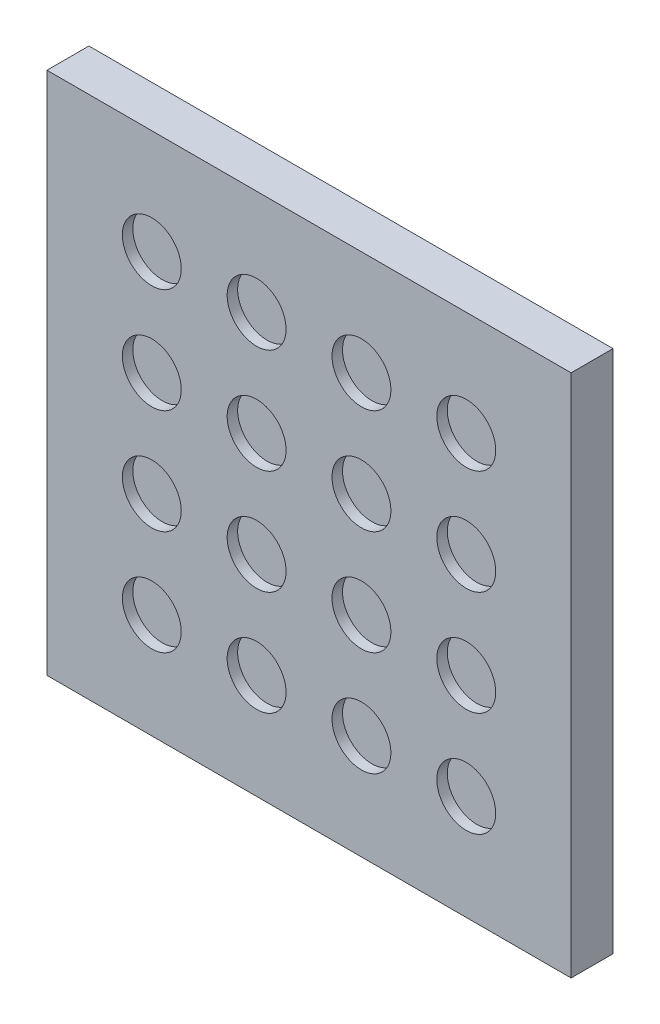
ISO-10303-21;
HEADER;
FILE_DESCRIPTION(('STEP AP214'),'2;1');
FILE_NAME('part.step','',(''),(''),'','','');
FILE_SCHEMA(('AUTOMOTIVE_DESIGN { 1 0 10303 214 1 1 1 1 }'));
ENDSEC;
DATA;
#1=APPLICATION_CONTEXT('core data for automotive mechanical design processes');
#2=APPLICATION_PROTOCOL_DEFINITION('international standard','automotive_design',2000,#1);
#3=PRODUCT_CONTEXT('',#1,'mechanical');
#4=PRODUCT('Part','Part','',(#3));
#5=PRODUCT_RELATED_PRODUCT_CATEGORY('part','',(#4));
#6=PRODUCT_DEFINITION_FORMATION('','',#4);
#7=PRODUCT_DEFINITION_CONTEXT('part definition',#1,'design');
#8=PRODUCT_DEFINITION('design','',#6,#7);
#9=PRODUCT_DEFINITION_SHAPE('','',#8);
#10=(LENGTH_UNIT() NAMED_UNIT(*) SI_UNIT(.MILLI.,.METRE.));
#11=(NAMED_UNIT(*) PLANE_ANGLE_UNIT() SI_UNIT($,.RADIAN.));
#12=(NAMED_UNIT(*) SI_UNIT($,.STERADIAN.) SOLID_ANGLE_UNIT());
#13=UNCERTAINTY_MEASURE_WITH_UNIT(LENGTH_MEASURE(1.E-05),#10,'distance_accuracy_value','');
#14=(GEOMETRIC_REPRESENTATION_CONTEXT(3) GLOBAL_UNCERTAINTY_ASSIGNED_CONTEXT((#13)) GLOBAL_UNIT_ASSIGNED_CONTEXT((#10,
#11,#12)) REPRESENTATION_CONTEXT('',''));
#15=CARTESIAN_POINT('',(0.,0.,0.));
#16=DIRECTION('',(0.,0.,1.));
#17=DIRECTION('',(1.,0.,0.));
#18=AXIS2_PLACEMENT_3D('',#15,#16,#17);
#19=CARTESIAN_POINT('',(0.,0.,1.));
#20=DIRECTION('',(0.,0.,1.));
#21=DIRECTION('',(1.,0.,0.));
#22=AXIS2_PLACEMENT_3D('',#19,#20,#21);
#23=PLANE('',#22);
#24=CARTESIAN_POINT('',(2.08264233531441E-13,-20.,1.));
#25=DIRECTION('',(0.,0.,1.));
#26=DIRECTION('',(1.,0.,0.));
#27=AXIS2_PLACEMENT_3D('',#24,#25,#26);
#28=CIRCLE('',#27,2.81);
#29=CARTESIAN_POINT('',(2.81000000000021,-20.,1.));
#30=VERTEX_POINT('',#29);
#31=EDGE_CURVE('E119',#30,#30,#28,.T.);
#32=ORIENTED_EDGE('',*,*,#31,.F.);
#33=EDGE_LOOP('',(#32));
#34=FACE_BOUND('',#33,.T.);
#35=CARTESIAN_POINT('',(30.0000000000003,-30.,1.));
#36=DIRECTION('',(0.,0.,1.));
#37=DIRECTION('',(1.,0.,0.));
#38=AXIS2_PLACEMENT_3D('',#35,#36,#37);
#39=CIRCLE('',#38,2.81);
#40=CARTESIAN_POINT('',(32.8100000000003,-30.,1.));
#41=VERTEX_POINT('',#40);
#42=EDGE_CURVE('E135',#41,#41,#39,.T.);
#43=ORIENTED_EDGE('',*,*,#42,.F.);
#44=EDGE_LOOP('',(#43));
#45=FACE_BOUND('',#44,.T.);
#46=CARTESIAN_POINT('',(10.0000000000003,-30.,1.));
#47=DIRECTION('',(0.,0.,1.));
#48=DIRECTION('',(1.,0.,0.));
#49=AXIS2_PLACEMENT_3D('',#46,#47,#48);
#50=CIRCLE('',#49,2.81);
#51=CARTESIAN_POINT('',(12.8100000000003,-30.,1.));
#52=VERTEX_POINT('',#51);
#53=EDGE_CURVE('E151',#52,#52,#50,.T.);
#54=ORIENTED_EDGE('',*,*,#53,.F.);
#55=EDGE_LOOP('',(#54));
#56=FACE_BOUND('',#55,.T.);
#57=CARTESIAN_POINT('',(20.0000000000002,-20.,1.));
#58=DIRECTION('',(0.,0.,1.));
#59=DIRECTION('',(1.,0.,0.));
#60=AXIS2_PLACEMENT_3D('',#57,#58,#59);
#61=CIRCLE('',#60,2.81);
#62=CARTESIAN_POINT('',(22.8100000000002,-20.,1.));
#63=VERTEX_POINT('',#62);
#64=EDGE_CURVE('E167',#63,#63,#61,.T.);
#65=ORIENTED_EDGE('',*,*,#64,.F.);
#66=EDGE_LOOP('',(#65));
#67=FACE_BOUND('',#66,.T.);
#68=CARTESIAN_POINT('',(30.0000000000001,-10.,1.));
#69=DIRECTION('',(0.,0.,1.));
#70=DIRECTION('',(1.,0.,0.));
#71=AXIS2_PLACEMENT_3D('',#68,#69,#70);
#72=CIRCLE('',#71,2.81);
#73=CARTESIAN_POINT('',(32.8100000000001,-10.,1.));
#74=VERTEX_POINT('',#73);
#75=EDGE_CURVE('E183',#74,#74,#72,.T.);
#76=ORIENTED_EDGE('',*,*,#75,.F.);
#77=EDGE_LOOP('',(#76));
#78=FACE_BOUND('',#77,.T.);
#79=CARTESIAN_POINT('',(10.0000000000001,-10.,1.));
#80=DIRECTION('',(0.,0.,1.));
#81=DIRECTION('',(1.,0.,0.));
#82=AXIS2_PLACEMENT_3D('',#79,#80,#81);
#83=CIRCLE('',#82,2.81);
#84=CARTESIAN_POINT('',(12.8100000000001,-10.,1.));
#85=VERTEX_POINT('',#84);
#86=EDGE_CURVE('E199',#85,#85,#83,.T.);
#87=ORIENTED_EDGE('',*,*,#86,.F.);
#88=EDGE_LOOP('',(#87));
#89=FACE_BOUND('',#88,.T.);
#90=CARTESIAN_POINT('',(20.,0.,1.));
#91=DIRECTION('',(0.,0.,1.));
#92=DIRECTION('',(1.,0.,0.));
#93=AXIS2_PLACEMENT_3D('',#90,#91,#92);
#94=CIRCLE('',#93,2.81);
#95=CARTESIAN_POINT('',(22.81,0.,1.));
#96=VERTEX_POINT('',#95);
#97=EDGE_CURVE('E215',#96,#96,#94,.T.);
#98=ORIENTED_EDGE('',*,*,#97,.F.);
#99=EDGE_LOOP('',(#98));
#100=FACE_BOUND('',#99,.T.);
#101=CARTESIAN_POINT('',(0.,0.,1.));
#102=DIRECTION('',(0.,0.,1.));
#103=DIRECTION('',(1.,0.,0.));
#104=AXIS2_PLACEMENT_3D('',#101,#102,#103);
#105=CIRCLE('',#104,2.81);
#106=CARTESIAN_POINT('',(2.81,0.,1.));
#107=VERTEX_POINT('',#106);
#108=EDGE_CURVE('E231',#107,#107,#105,.T.);
#109=ORIENTED_EDGE('',*,*,#108,.F.);
#110=EDGE_LOOP('',(#109));
#111=FACE_BOUND('',#110,.T.);
#112=DIRECTION('',(0.,-1.,0.));
#113=VECTOR('',#112,1.);
#114=CARTESIAN_POINT('',(-9.9999999999999,9.9999999999999,1.));
#115=LINE('',#114,#113);
#116=CARTESIAN_POINT('',(-9.9999999999999,9.9999999999999,1.));
#117=VERTEX_POINT('',#116);
#118=CARTESIAN_POINT('',(-9.99999999999989,-40.,1.));
#119=VERTEX_POINT('',#118);
#120=EDGE_CURVE('E85',#117,#119,#115,.T.);
#121=ORIENTED_EDGE('',*,*,#120,.T.);
#122=DIRECTION('',(1.,0.,0.));
#123=VECTOR('',#122,1.);
#124=CARTESIAN_POINT('',(-9.99999999999989,-40.,1.));
#125=LINE('',#124,#123);
#126=CARTESIAN_POINT('',(40.,-40.,1.));
#127=VERTEX_POINT('',#126);
#128=EDGE_CURVE('E240',#119,#127,#125,.T.);
#129=ORIENTED_EDGE('',*,*,#128,.T.);
#130=DIRECTION('',(0.,1.,0.));
#131=VECTOR('',#130,1.);
#132=CARTESIAN_POINT('',(40.,9.9999999999999,1.));
#133=LINE('',#132,#131);
#134=CARTESIAN_POINT('',(40.,9.9999999999999,1.));
#135=VERTEX_POINT('',#134);
#136=EDGE_CURVE('E60',#127,#135,#133,.T.);
#137=ORIENTED_EDGE('',*,*,#136,.T.);
#138=DIRECTION('',(-1.,0.,0.));
#139=VECTOR('',#138,1.);
#140=CARTESIAN_POINT('',(-9.9999999999999,9.9999999999999,1.));
#141=LINE('',#140,#139);
#142=EDGE_CURVE('E55',#135,#117,#141,.T.);
#143=ORIENTED_EDGE('',*,*,#142,.T.);
#144=EDGE_LOOP('',(#121,#129,#137,#143));
#145=FACE_BOUND('',#144,.T.);
#146=CARTESIAN_POINT('',(10.,0.,1.));
#147=DIRECTION('',(0.,0.,1.));
#148=DIRECTION('',(1.,0.,0.));
#149=AXIS2_PLACEMENT_3D('',#146,#147,#148);
#150=CIRCLE('',#149,2.81);
#151=CARTESIAN_POINT('',(12.81,0.,1.));
#152=VERTEX_POINT('',#151);
#153=EDGE_CURVE('E223',#152,#152,#150,.T.);
#154=ORIENTED_EDGE('',*,*,#153,.F.);
#155=EDGE_LOOP('',(#154));
#156=FACE_BOUND('',#155,.T.);
#157=CARTESIAN_POINT('',(30.,0.,1.));
#158=DIRECTION('',(0.,0.,1.));
#159=DIRECTION('',(1.,0.,0.));
#160=AXIS2_PLACEMENT_3D('',#157,#158,#159);
#161=CIRCLE('',#160,2.81);
#162=CARTESIAN_POINT('',(32.81,0.,1.));
#163=VERTEX_POINT('',#162);
#164=EDGE_CURVE('E207',#163,#163,#161,.T.);
#165=ORIENTED_EDGE('',*,*,#164,.F.);
#166=EDGE_LOOP('',(#165));
#167=FACE_BOUND('',#166,.T.);
#168=CARTESIAN_POINT('',(20.0000000000001,-10.,1.));
#169=DIRECTION('',(0.,0.,1.));
#170=DIRECTION('',(1.,0.,0.));
#171=AXIS2_PLACEMENT_3D('',#168,#169,#170);
#172=CIRCLE('',#171,2.81);
#173=CARTESIAN_POINT('',(22.8100000000001,-10.,1.));
#174=VERTEX_POINT('',#173);
#175=EDGE_CURVE('E191',#174,#174,#172,.T.);
#176=ORIENTED_EDGE('',*,*,#175,.F.);
#177=EDGE_LOOP('',(#176));
#178=FACE_BOUND('',#177,.T.);
#179=CARTESIAN_POINT('',(10.0000000000002,-20.,1.));
#180=DIRECTION('',(0.,0.,1.));
#181=DIRECTION('',(1.,0.,0.));
#182=AXIS2_PLACEMENT_3D('',#179,#180,#181);
#183=CIRCLE('',#182,2.81);
#184=CARTESIAN_POINT('',(12.8100000000002,-20.,1.));
#185=VERTEX_POINT('',#184);
#186=EDGE_CURVE('E175',#185,#185,#183,.T.);
#187=ORIENTED_EDGE('',*,*,#186,.F.);
#188=EDGE_LOOP('',(#187));
#189=FACE_BOUND('',#188,.T.);
#190=CARTESIAN_POINT('',(30.0000000000002,-20.,1.));
#191=DIRECTION('',(0.,0.,1.));
#192=DIRECTION('',(1.,0.,0.));
#193=AXIS2_PLACEMENT_3D('',#190,#191,#192);
#194=CIRCLE('',#193,2.81);
#195=CARTESIAN_POINT('',(32.8100000000002,-20.,1.));
#196=VERTEX_POINT('',#195);
#197=EDGE_CURVE('E159',#196,#196,#194,.T.);
#198=ORIENTED_EDGE('',*,*,#197,.F.);
#199=EDGE_LOOP('',(#198));
#200=FACE_BOUND('',#199,.T.);
#201=CARTESIAN_POINT('',(20.0000000000003,-30.,1.));
#202=DIRECTION('',(0.,0.,1.));
#203=DIRECTION('',(1.,0.,0.));
#204=AXIS2_PLACEMENT_3D('',#201,#202,#203);
#205=CIRCLE('',#204,2.81);
#206=CARTESIAN_POINT('',(22.8100000000003,-30.,1.));
#207=VERTEX_POINT('',#206);
#208=EDGE_CURVE('E143',#207,#207,#205,.T.);
#209=ORIENTED_EDGE('',*,*,#208,.F.);
#210=EDGE_LOOP('',(#209));
#211=FACE_BOUND('',#210,.T.);
#212=CARTESIAN_POINT('',(1.0413211676572E-13,-10.,1.));
#213=DIRECTION('',(0.,0.,1.));
#214=DIRECTION('',(1.,0.,0.));
#215=AXIS2_PLACEMENT_3D('',#212,#213,#214);
#216=CIRCLE('',#215,2.81);
#217=CARTESIAN_POINT('',(2.8100000000001,-10.,1.));
#218=VERTEX_POINT('',#217);
#219=EDGE_CURVE('E127',#218,#218,#216,.T.);
#220=ORIENTED_EDGE('',*,*,#219,.F.);
#221=EDGE_LOOP('',(#220));
#222=FACE_BOUND('',#221,.T.);
#223=CARTESIAN_POINT('',(3.12396350297161E-13,-30.,1.));
#224=DIRECTION('',(0.,0.,1.));
#225=DIRECTION('',(1.,0.,0.));
#226=AXIS2_PLACEMENT_3D('',#223,#224,#225);
#227=CIRCLE('',#226,2.81);
#228=CARTESIAN_POINT('',(2.81000000000031,-30.,1.));
#229=VERTEX_POINT('',#228);
#230=EDGE_CURVE('E111',#229,#229,#227,.T.);
#231=ORIENTED_EDGE('',*,*,#230,.F.);
#232=EDGE_LOOP('',(#231));
#233=FACE_BOUND('',#232,.T.);
#234=ADVANCED_FACE('F39',(#34,#45,#56,#67,#78,#89,#100,#111,#145,#156,#167,#178,#189,#200,#211,
#222,#233),#23,.T.);
#235=CARTESIAN_POINT('',(-9.9999999999999,9.9999999999999,1.));
#236=DIRECTION('',(1.,0.,0.));
#237=DIRECTION('',(0.,1.,0.));
#238=AXIS2_PLACEMENT_3D('',#235,#236,#237);
#239=PLANE('',#238);
#240=DIRECTION('',(0.,0.,-1.));
#241=VECTOR('',#240,1.);
#242=CARTESIAN_POINT('',(-9.9999999999999,9.9999999999999,1.));
#243=LINE('',#242,#241);
#244=CARTESIAN_POINT('',(-9.9999999999999,9.9999999999999,-3.));
#245=VERTEX_POINT('',#244);
#246=EDGE_CURVE('E80',#117,#245,#243,.T.);
#247=ORIENTED_EDGE('',*,*,#246,.T.);
#248=DIRECTION('',(0.,1.,0.));
#249=VECTOR('',#248,1.);
#250=CARTESIAN_POINT('',(-9.9999999999999,9.9999999999999,-3.));
#251=LINE('',#250,#249);
#252=CARTESIAN_POINT('',(-9.9999999999999,-40.,-3.));
#253=VERTEX_POINT('',#252);
#254=EDGE_CURVE('E84',#253,#245,#251,.T.);
#255=ORIENTED_EDGE('',*,*,#254,.F.);
#256=DIRECTION('',(0.,0.,-1.));
#257=VECTOR('',#256,1.);
#258=CARTESIAN_POINT('',(-9.99999999999989,-40.,1.));
#259=LINE('',#258,#257);
#260=EDGE_CURVE('E11',#119,#253,#259,.T.);
#261=ORIENTED_EDGE('',*,*,#260,.F.);
#262=ORIENTED_EDGE('',*,*,#120,.F.);
#263=EDGE_LOOP('',(#247,#255,#261,#262));
#264=FACE_BOUND('',#263,.T.);
#265=ADVANCED_FACE('F41',(#264),#239,.F.);
#266=CARTESIAN_POINT('',(-9.99999999999989,-40.,1.));
#267=DIRECTION('',(0.,1.,0.));
#268=DIRECTION('',(0.,0.,1.));
#269=AXIS2_PLACEMENT_3D('',#266,#267,#268);
#270=PLANE('',#269);
#271=ORIENTED_EDGE('',*,*,#260,.T.);
#272=DIRECTION('',(-1.,0.,0.));
#273=VECTOR('',#272,1.);
#274=CARTESIAN_POINT('',(-9.9999999999999,-40.,-3.));
#275=LINE('',#274,#273);
#276=CARTESIAN_POINT('',(40.,-40.,-3.));
#277=VERTEX_POINT('',#276);
#278=EDGE_CURVE('E102',#277,#253,#275,.T.);
#279=ORIENTED_EDGE('',*,*,#278,.F.);
#280=DIRECTION('',(0.,0.,-1.));
#281=VECTOR('',#280,1.);
#282=CARTESIAN_POINT('',(40.,-40.,1.));
#283=LINE('',#282,#281);
#284=EDGE_CURVE('E48',#127,#277,#283,.T.);
#285=ORIENTED_EDGE('',*,*,#284,.F.);
#286=ORIENTED_EDGE('',*,*,#128,.F.);
#287=EDGE_LOOP('',(#271,#279,#285,#286));
#288=FACE_BOUND('',#287,.T.);
#289=ADVANCED_FACE('F253',(#288),#270,.F.);
#290=CARTESIAN_POINT('',(40.,9.9999999999999,1.));
#291=DIRECTION('',(-1.,0.,0.));
#292=DIRECTION('',(0.,-1.,0.));
#293=AXIS2_PLACEMENT_3D('',#290,#291,#292);
#294=PLANE('',#293);
#295=ORIENTED_EDGE('',*,*,#284,.T.);
#296=DIRECTION('',(0.,-1.,0.));
#297=VECTOR('',#296,1.);
#298=CARTESIAN_POINT('',(40.,9.9999999999999,-3.));
#299=LINE('',#298,#297);
#300=CARTESIAN_POINT('',(40.,9.9999999999999,-3.));
#301=VERTEX_POINT('',#300);
#302=EDGE_CURVE('E97',#301,#277,#299,.T.);
#303=ORIENTED_EDGE('',*,*,#302,.F.);
#304=DIRECTION('',(0.,0.,-1.));
#305=VECTOR('',#304,1.);
#306=CARTESIAN_POINT('',(40.,9.9999999999999,1.));
#307=LINE('',#306,#305);
#308=EDGE_CURVE('E88',#135,#301,#307,.T.);
#309=ORIENTED_EDGE('',*,*,#308,.F.);
#310=ORIENTED_EDGE('',*,*,#136,.F.);
#311=EDGE_LOOP('',(#295,#303,#309,#310));
#312=FACE_BOUND('',#311,.T.);
#313=ADVANCED_FACE('F251',(#312),#294,.F.);
#314=CARTESIAN_POINT('',(-9.9999999999999,9.9999999999999,1.));
#315=DIRECTION('',(0.,-1.,0.));
#316=DIRECTION('',(0.,0.,-1.));
#317=AXIS2_PLACEMENT_3D('',#314,#315,#316);
#318=PLANE('',#317);
#319=ORIENTED_EDGE('',*,*,#308,.T.);
#320=DIRECTION('',(1.,0.,0.));
#321=VECTOR('',#320,1.);
#322=CARTESIAN_POINT('',(-9.9999999999999,9.9999999999999,-3.));
#323=LINE('',#322,#321);
#324=EDGE_CURVE('E91',#245,#301,#323,.T.);
#325=ORIENTED_EDGE('',*,*,#324,.F.);
#326=ORIENTED_EDGE('',*,*,#246,.F.);
#327=ORIENTED_EDGE('',*,*,#142,.F.);
#328=EDGE_LOOP('',(#319,#325,#326,#327));
#329=FACE_BOUND('',#328,.T.);
#330=ADVANCED_FACE('F92',(#329),#318,.F.);
#331=CARTESIAN_POINT('',(0.,0.,1.));
#332=DIRECTION('',(0.,0.,-1.));
#333=DIRECTION('',(-1.,0.,0.));
#334=AXIS2_PLACEMENT_3D('',#331,#332,#333);
#335=CYLINDRICAL_SURFACE('',#334,2.81);
#336=ORIENTED_EDGE('',*,*,#108,.T.);
#337=EDGE_LOOP('',(#336));
#338=FACE_BOUND('',#337,.T.);
#339=CARTESIAN_POINT('',(0.,0.,0.));
#340=DIRECTION('',(0.,0.,1.));
#341=DIRECTION('',(1.,0.,0.));
#342=AXIS2_PLACEMENT_3D('',#339,#340,#341);
#343=CIRCLE('',#342,2.81);
#344=CARTESIAN_POINT('',(2.81,0.,0.));
#345=VERTEX_POINT('',#344);
#346=EDGE_CURVE('E227',#345,#345,#343,.T.);
#347=ORIENTED_EDGE('',*,*,#346,.F.);
#348=EDGE_LOOP('',(#347));
#349=FACE_BOUND('',#348,.T.);
#350=ADVANCED_FACE('F303',(#338,#349),#335,.F.);
#351=CARTESIAN_POINT('',(10.,0.,1.));
#352=DIRECTION('',(0.,0.,-1.));
#353=DIRECTION('',(-1.,0.,0.));
#354=AXIS2_PLACEMENT_3D('',#351,#352,#353);
#355=CYLINDRICAL_SURFACE('',#354,2.81);
#356=ORIENTED_EDGE('',*,*,#153,.T.);
#357=EDGE_LOOP('',(#356));
#358=FACE_BOUND('',#357,.T.);
#359=CARTESIAN_POINT('',(10.,0.,0.));
#360=DIRECTION('',(0.,0.,1.));
#361=DIRECTION('',(1.,0.,0.));
#362=AXIS2_PLACEMENT_3D('',#359,#360,#361);
#363=CIRCLE('',#362,2.81);
#364=CARTESIAN_POINT('',(12.81,0.,0.));
#365=VERTEX_POINT('',#364);
#366=EDGE_CURVE('E219',#365,#365,#363,.T.);
#367=ORIENTED_EDGE('',*,*,#366,.F.);
#368=EDGE_LOOP('',(#367));
#369=FACE_BOUND('',#368,.T.);
#370=ADVANCED_FACE('F305',(#358,#369),#355,.F.);
#371=CARTESIAN_POINT('',(20.,0.,1.));
#372=DIRECTION('',(0.,0.,-1.));
#373=DIRECTION('',(-1.,0.,0.));
#374=AXIS2_PLACEMENT_3D('',#371,#372,#373);
#375=CYLINDRICAL_SURFACE('',#374,2.81);
#376=ORIENTED_EDGE('',*,*,#97,.T.);
#377=EDGE_LOOP('',(#376));
#378=FACE_BOUND('',#377,.T.);
#379=CARTESIAN_POINT('',(20.,0.,0.));
#380=DIRECTION('',(0.,0.,1.));
#381=DIRECTION('',(1.,0.,0.));
#382=AXIS2_PLACEMENT_3D('',#379,#380,#381);
#383=CIRCLE('',#382,2.81);
#384=CARTESIAN_POINT('',(22.81,0.,0.));
#385=VERTEX_POINT('',#384);
#386=EDGE_CURVE('E211',#385,#385,#383,.T.);
#387=ORIENTED_EDGE('',*,*,#386,.F.);
#388=EDGE_LOOP('',(#387));
#389=FACE_BOUND('',#388,.T.);
#390=ADVANCED_FACE('F312',(#378,#389),#375,.F.);
#391=CARTESIAN_POINT('',(30.,0.,1.));
#392=DIRECTION('',(0.,0.,-1.));
#393=DIRECTION('',(-1.,0.,0.));
#394=AXIS2_PLACEMENT_3D('',#391,#392,#393);
#395=CYLINDRICAL_SURFACE('',#394,2.81);
#396=ORIENTED_EDGE('',*,*,#164,.T.);
#397=EDGE_LOOP('',(#396));
#398=FACE_BOUND('',#397,.T.);
#399=CARTESIAN_POINT('',(30.,0.,0.));
#400=DIRECTION('',(0.,0.,1.));
#401=DIRECTION('',(1.,0.,0.));
#402=AXIS2_PLACEMENT_3D('',#399,#400,#401);
#403=CIRCLE('',#402,2.81);
#404=CARTESIAN_POINT('',(32.81,0.,0.));
#405=VERTEX_POINT('',#404);
#406=EDGE_CURVE('E203',#405,#405,#403,.T.);
#407=ORIENTED_EDGE('',*,*,#406,.F.);
#408=EDGE_LOOP('',(#407));
#409=FACE_BOUND('',#408,.T.);
#410=ADVANCED_FACE('F351',(#398,#409),#395,.F.);
#411=CARTESIAN_POINT('',(10.0000000000001,-10.,1.));
#412=DIRECTION('',(0.,0.,-1.));
#413=DIRECTION('',(-1.,0.,0.));
#414=AXIS2_PLACEMENT_3D('',#411,#412,#413);
#415=CYLINDRICAL_SURFACE('',#414,2.81);
#416=ORIENTED_EDGE('',*,*,#86,.T.);
#417=EDGE_LOOP('',(#416));
#418=FACE_BOUND('',#417,.T.);
#419=CARTESIAN_POINT('',(10.0000000000001,-10.,0.));
#420=DIRECTION('',(0.,0.,1.));
#421=DIRECTION('',(1.,0.,0.));
#422=AXIS2_PLACEMENT_3D('',#419,#420,#421);
#423=CIRCLE('',#422,2.81);
#424=CARTESIAN_POINT('',(12.8100000000001,-10.,0.));
#425=VERTEX_POINT('',#424);
#426=EDGE_CURVE('E195',#425,#425,#423,.T.);
#427=ORIENTED_EDGE('',*,*,#426,.F.);
#428=EDGE_LOOP('',(#427));
#429=FACE_BOUND('',#428,.T.);
#430=ADVANCED_FACE('F360',(#418,#429),#415,.F.);
#431=CARTESIAN_POINT('',(20.0000000000001,-10.,1.));
#432=DIRECTION('',(0.,0.,-1.));
#433=DIRECTION('',(-1.,0.,0.));
#434=AXIS2_PLACEMENT_3D('',#431,#432,#433);
#435=CYLINDRICAL_SURFACE('',#434,2.81);
#436=ORIENTED_EDGE('',*,*,#175,.T.);
#437=EDGE_LOOP('',(#436));
#438=FACE_BOUND('',#437,.T.);
#439=CARTESIAN_POINT('',(20.0000000000001,-10.,0.));
#440=DIRECTION('',(0.,0.,1.));
#441=DIRECTION('',(1.,0.,0.));
#442=AXIS2_PLACEMENT_3D('',#439,#440,#441);
#443=CIRCLE('',#442,2.81);
#444=CARTESIAN_POINT('',(22.8100000000001,-10.,0.));
#445=VERTEX_POINT('',#444);
#446=EDGE_CURVE('E187',#445,#445,#443,.T.);
#447=ORIENTED_EDGE('',*,*,#446,.F.);
#448=EDGE_LOOP('',(#447));
#449=FACE_BOUND('',#448,.T.);
#450=ADVANCED_FACE('F370',(#438,#449),#435,.F.);
#451=CARTESIAN_POINT('',(30.0000000000001,-10.,1.));
#452=DIRECTION('',(0.,0.,-1.));
#453=DIRECTION('',(-1.,0.,0.));
#454=AXIS2_PLACEMENT_3D('',#451,#452,#453);
#455=CYLINDRICAL_SURFACE('',#454,2.81);
#456=ORIENTED_EDGE('',*,*,#75,.T.);
#457=EDGE_LOOP('',(#456));
#458=FACE_BOUND('',#457,.T.);
#459=CARTESIAN_POINT('',(30.0000000000001,-10.,0.));
#460=DIRECTION('',(0.,0.,1.));
#461=DIRECTION('',(1.,0.,0.));
#462=AXIS2_PLACEMENT_3D('',#459,#460,#461);
#463=CIRCLE('',#462,2.81);
#464=CARTESIAN_POINT('',(32.8100000000001,-10.,0.));
#465=VERTEX_POINT('',#464);
#466=EDGE_CURVE('E179',#465,#465,#463,.T.);
#467=ORIENTED_EDGE('',*,*,#466,.F.);
#468=EDGE_LOOP('',(#467));
#469=FACE_BOUND('',#468,.T.);
#470=ADVANCED_FACE('F380',(#458,#469),#455,.F.);
#471=CARTESIAN_POINT('',(10.0000000000002,-20.,1.));
#472=DIRECTION('',(0.,0.,-1.));
#473=DIRECTION('',(-1.,0.,0.));
#474=AXIS2_PLACEMENT_3D('',#471,#472,#473);
#475=CYLINDRICAL_SURFACE('',#474,2.81);
#476=ORIENTED_EDGE('',*,*,#186,.T.);
#477=EDGE_LOOP('',(#476));
#478=FACE_BOUND('',#477,.T.);
#479=CARTESIAN_POINT('',(10.0000000000002,-20.,0.));
#480=DIRECTION('',(0.,0.,1.));
#481=DIRECTION('',(1.,0.,0.));
#482=AXIS2_PLACEMENT_3D('',#479,#480,#481);
#483=CIRCLE('',#482,2.81);
#484=CARTESIAN_POINT('',(12.8100000000002,-20.,0.));
#485=VERTEX_POINT('',#484);
#486=EDGE_CURVE('E171',#485,#485,#483,.T.);
#487=ORIENTED_EDGE('',*,*,#486,.F.);
#488=EDGE_LOOP('',(#487));
#489=FACE_BOUND('',#488,.T.);
#490=ADVANCED_FACE('F390',(#478,#489),#475,.F.);
#491=CARTESIAN_POINT('',(20.0000000000002,-20.,1.));
#492=DIRECTION('',(0.,0.,-1.));
#493=DIRECTION('',(-1.,0.,0.));
#494=AXIS2_PLACEMENT_3D('',#491,#492,#493);
#495=CYLINDRICAL_SURFACE('',#494,2.81);
#496=ORIENTED_EDGE('',*,*,#64,.T.);
#497=EDGE_LOOP('',(#496));
#498=FACE_BOUND('',#497,.T.);
#499=CARTESIAN_POINT('',(20.0000000000002,-20.,0.));
#500=DIRECTION('',(0.,0.,1.));
#501=DIRECTION('',(1.,0.,0.));
#502=AXIS2_PLACEMENT_3D('',#499,#500,#501);
#503=CIRCLE('',#502,2.81);
#504=CARTESIAN_POINT('',(22.8100000000002,-20.,0.));
#505=VERTEX_POINT('',#504);
#506=EDGE_CURVE('E163',#505,#505,#503,.T.);
#507=ORIENTED_EDGE('',*,*,#506,.F.);
#508=EDGE_LOOP('',(#507));
#509=FACE_BOUND('',#508,.T.);
#510=ADVANCED_FACE('F400',(#498,#509),#495,.F.);
#511=CARTESIAN_POINT('',(30.0000000000002,-20.,1.));
#512=DIRECTION('',(0.,0.,-1.));
#513=DIRECTION('',(-1.,0.,0.));
#514=AXIS2_PLACEMENT_3D('',#511,#512,#513);
#515=CYLINDRICAL_SURFACE('',#514,2.81);
#516=ORIENTED_EDGE('',*,*,#197,.T.);
#517=EDGE_LOOP('',(#516));
#518=FACE_BOUND('',#517,.T.);
#519=CARTESIAN_POINT('',(30.0000000000002,-20.,0.));
#520=DIRECTION('',(0.,0.,1.));
#521=DIRECTION('',(1.,0.,0.));
#522=AXIS2_PLACEMENT_3D('',#519,#520,#521);
#523=CIRCLE('',#522,2.81);
#524=CARTESIAN_POINT('',(32.8100000000002,-20.,0.));
#525=VERTEX_POINT('',#524);
#526=EDGE_CURVE('E155',#525,#525,#523,.T.);
#527=ORIENTED_EDGE('',*,*,#526,.F.);
#528=EDGE_LOOP('',(#527));
#529=FACE_BOUND('',#528,.T.);
#530=ADVANCED_FACE('F410',(#518,#529),#515,.F.);
#531=CARTESIAN_POINT('',(10.0000000000003,-30.,1.));
#532=DIRECTION('',(0.,0.,-1.));
#533=DIRECTION('',(-1.,0.,0.));
#534=AXIS2_PLACEMENT_3D('',#531,#532,#533);
#535=CYLINDRICAL_SURFACE('',#534,2.81);
#536=ORIENTED_EDGE('',*,*,#53,.T.);
#537=EDGE_LOOP('',(#536));
#538=FACE_BOUND('',#537,.T.);
#539=CARTESIAN_POINT('',(10.0000000000003,-30.,0.));
#540=DIRECTION('',(0.,0.,1.));
#541=DIRECTION('',(1.,0.,0.));
#542=AXIS2_PLACEMENT_3D('',#539,#540,#541);
#543=CIRCLE('',#542,2.81);
#544=CARTESIAN_POINT('',(12.8100000000003,-30.,0.));
#545=VERTEX_POINT('',#544);
#546=EDGE_CURVE('E147',#545,#545,#543,.T.);
#547=ORIENTED_EDGE('',*,*,#546,.F.);
#548=EDGE_LOOP('',(#547));
#549=FACE_BOUND('',#548,.T.);
#550=ADVANCED_FACE('F420',(#538,#549),#535,.F.);
#551=CARTESIAN_POINT('',(20.0000000000003,-30.,1.));
#552=DIRECTION('',(0.,0.,-1.));
#553=DIRECTION('',(-1.,0.,0.));
#554=AXIS2_PLACEMENT_3D('',#551,#552,#553);
#555=CYLINDRICAL_SURFACE('',#554,2.81);
#556=ORIENTED_EDGE('',*,*,#208,.T.);
#557=EDGE_LOOP('',(#556));
#558=FACE_BOUND('',#557,.T.);
#559=CARTESIAN_POINT('',(20.0000000000003,-30.,0.));
#560=DIRECTION('',(0.,0.,1.));
#561=DIRECTION('',(1.,0.,0.));
#562=AXIS2_PLACEMENT_3D('',#559,#560,#561);
#563=CIRCLE('',#562,2.81);
#564=CARTESIAN_POINT('',(22.8100000000003,-30.,0.));
#565=VERTEX_POINT('',#564);
#566=EDGE_CURVE('E139',#565,#565,#563,.T.);
#567=ORIENTED_EDGE('',*,*,#566,.F.);
#568=EDGE_LOOP('',(#567));
#569=FACE_BOUND('',#568,.T.);
#570=ADVANCED_FACE('F430',(#558,#569),#555,.F.);
#571=CARTESIAN_POINT('',(30.0000000000003,-30.,1.));
#572=DIRECTION('',(0.,0.,-1.));
#573=DIRECTION('',(-1.,0.,0.));
#574=AXIS2_PLACEMENT_3D('',#571,#572,#573);
#575=CYLINDRICAL_SURFACE('',#574,2.81);
#576=ORIENTED_EDGE('',*,*,#42,.T.);
#577=EDGE_LOOP('',(#576));
#578=FACE_BOUND('',#577,.T.);
#579=CARTESIAN_POINT('',(30.0000000000003,-30.,0.));
#580=DIRECTION('',(0.,0.,1.));
#581=DIRECTION('',(1.,0.,0.));
#582=AXIS2_PLACEMENT_3D('',#579,#580,#581);
#583=CIRCLE('',#582,2.81);
#584=CARTESIAN_POINT('',(32.8100000000003,-30.,0.));
#585=VERTEX_POINT('',#584);
#586=EDGE_CURVE('E131',#585,#585,#583,.T.);
#587=ORIENTED_EDGE('',*,*,#586,.F.);
#588=EDGE_LOOP('',(#587));
#589=FACE_BOUND('',#588,.T.);
#590=ADVANCED_FACE('F440',(#578,#589),#575,.F.);
#591=CARTESIAN_POINT('',(1.0413211676572E-13,-10.,1.));
#592=DIRECTION('',(0.,0.,-1.));
#593=DIRECTION('',(-1.,0.,0.));
#594=AXIS2_PLACEMENT_3D('',#591,#592,#593);
#595=CYLINDRICAL_SURFACE('',#594,2.81);
#596=ORIENTED_EDGE('',*,*,#219,.T.);
#597=EDGE_LOOP('',(#596));
#598=FACE_BOUND('',#597,.T.);
#599=CARTESIAN_POINT('',(1.0413211676572E-13,-10.,0.));
#600=DIRECTION('',(0.,0.,1.));
#601=DIRECTION('',(1.,0.,0.));
#602=AXIS2_PLACEMENT_3D('',#599,#600,#601);
#603=CIRCLE('',#602,2.81);
#604=CARTESIAN_POINT('',(2.8100000000001,-10.,0.));
#605=VERTEX_POINT('',#604);
#606=EDGE_CURVE('E123',#605,#605,#603,.T.);
#607=ORIENTED_EDGE('',*,*,#606,.F.);
#608=EDGE_LOOP('',(#607));
#609=FACE_BOUND('',#608,.T.);
#610=ADVANCED_FACE('F450',(#598,#609),#595,.F.);
#611=CARTESIAN_POINT('',(2.08264233531441E-13,-20.,1.));
#612=DIRECTION('',(0.,0.,-1.));
#613=DIRECTION('',(-1.,0.,0.));
#614=AXIS2_PLACEMENT_3D('',#611,#612,#613);
#615=CYLINDRICAL_SURFACE('',#614,2.81);
#616=ORIENTED_EDGE('',*,*,#31,.T.);
#617=EDGE_LOOP('',(#616));
#618=FACE_BOUND('',#617,.T.);
#619=CARTESIAN_POINT('',(2.08264233531441E-13,-20.,0.));
#620=DIRECTION('',(0.,0.,1.));
#621=DIRECTION('',(1.,0.,0.));
#622=AXIS2_PLACEMENT_3D('',#619,#620,#621);
#623=CIRCLE('',#622,2.81);
#624=CARTESIAN_POINT('',(2.81000000000021,-20.,0.));
#625=VERTEX_POINT('',#624);
#626=EDGE_CURVE('E115',#625,#625,#623,.T.);
#627=ORIENTED_EDGE('',*,*,#626,.F.);
#628=EDGE_LOOP('',(#627));
#629=FACE_BOUND('',#628,.T.);
#630=ADVANCED_FACE('F278',(#618,#629),#615,.F.);
#631=CARTESIAN_POINT('',(3.12396350297161E-13,-30.,1.));
#632=DIRECTION('',(0.,0.,-1.));
#633=DIRECTION('',(-1.,0.,0.));
#634=AXIS2_PLACEMENT_3D('',#631,#632,#633);
#635=CYLINDRICAL_SURFACE('',#634,2.81);
#636=ORIENTED_EDGE('',*,*,#230,.T.);
#637=EDGE_LOOP('',(#636));
#638=FACE_BOUND('',#637,.T.);
#639=CARTESIAN_POINT('',(3.12396350297161E-13,-30.,0.));
#640=DIRECTION('',(0.,0.,1.));
#641=DIRECTION('',(1.,0.,0.));
#642=AXIS2_PLACEMENT_3D('',#639,#640,#641);
#643=CIRCLE('',#642,2.81);
#644=CARTESIAN_POINT('',(2.81000000000031,-30.,0.));
#645=VERTEX_POINT('',#644);
#646=EDGE_CURVE('E110',#645,#645,#643,.T.);
#647=ORIENTED_EDGE('',*,*,#646,.F.);
#648=EDGE_LOOP('',(#647));
#649=FACE_BOUND('',#648,.T.);
#650=ADVANCED_FACE('F274',(#638,#649),#635,.F.);
#651=CARTESIAN_POINT('',(0.,0.,0.));
#652=DIRECTION('',(0.,0.,1.));
#653=DIRECTION('',(1.,0.,0.));
#654=AXIS2_PLACEMENT_3D('',#651,#652,#653);
#655=PLANE('',#654);
#656=ORIENTED_EDGE('',*,*,#646,.T.);
#657=EDGE_LOOP('',(#656));
#658=FACE_BOUND('',#657,.T.);
#659=ADVANCED_FACE('F277',(#658),#655,.T.);
#660=ORIENTED_EDGE('',*,*,#626,.T.);
#661=EDGE_LOOP('',(#660));
#662=FACE_BOUND('',#661,.T.);
#663=ADVANCED_FACE('F283',(#662),#655,.T.);
#664=ORIENTED_EDGE('',*,*,#606,.T.);
#665=EDGE_LOOP('',(#664));
#666=FACE_BOUND('',#665,.T.);
#667=ADVANCED_FACE('F289',(#666),#655,.T.);
#668=ORIENTED_EDGE('',*,*,#586,.T.);
#669=EDGE_LOOP('',(#668));
#670=FACE_BOUND('',#669,.T.);
#671=ADVANCED_FACE('F519',(#670),#655,.T.);
#672=ORIENTED_EDGE('',*,*,#566,.T.);
#673=EDGE_LOOP('',(#672));
#674=FACE_BOUND('',#673,.T.);
#675=ADVANCED_FACE('F527',(#674),#655,.T.);
#676=ORIENTED_EDGE('',*,*,#546,.T.);
#677=EDGE_LOOP('',(#676));
#678=FACE_BOUND('',#677,.T.);
#679=ADVANCED_FACE('F535',(#678),#655,.T.);
#680=ORIENTED_EDGE('',*,*,#526,.T.);
#681=EDGE_LOOP('',(#680));
#682=FACE_BOUND('',#681,.T.);
#683=ADVANCED_FACE('F543',(#682),#655,.T.);
#684=ORIENTED_EDGE('',*,*,#506,.T.);
#685=EDGE_LOOP('',(#684));
#686=FACE_BOUND('',#685,.T.);
#687=ADVANCED_FACE('F551',(#686),#655,.T.);
#688=ORIENTED_EDGE('',*,*,#486,.T.);
#689=EDGE_LOOP('',(#688));
#690=FACE_BOUND('',#689,.T.);
#691=ADVANCED_FACE('F559',(#690),#655,.T.);
#692=ORIENTED_EDGE('',*,*,#466,.T.);
#693=EDGE_LOOP('',(#692));
#694=FACE_BOUND('',#693,.T.);
#695=ADVANCED_FACE('F567',(#694),#655,.T.);
#696=ORIENTED_EDGE('',*,*,#446,.T.);
#697=EDGE_LOOP('',(#696));
#698=FACE_BOUND('',#697,.T.);
#699=ADVANCED_FACE('F575',(#698),#655,.T.);
#700=ORIENTED_EDGE('',*,*,#426,.T.);
#701=EDGE_LOOP('',(#700));
#702=FACE_BOUND('',#701,.T.);
#703=ADVANCED_FACE('F583',(#702),#655,.T.);
#704=ORIENTED_EDGE('',*,*,#406,.T.);
#705=EDGE_LOOP('',(#704));
#706=FACE_BOUND('',#705,.T.);
#707=ADVANCED_FACE('F591',(#706),#655,.T.);
#708=ORIENTED_EDGE('',*,*,#386,.T.);
#709=EDGE_LOOP('',(#708));
#710=FACE_BOUND('',#709,.T.);
#711=ADVANCED_FACE('F299',(#710),#655,.T.);
#712=ORIENTED_EDGE('',*,*,#366,.T.);
#713=EDGE_LOOP('',(#712));
#714=FACE_BOUND('',#713,.T.);
#715=ADVANCED_FACE('F293',(#714),#655,.T.);
#716=ORIENTED_EDGE('',*,*,#346,.T.);
#717=EDGE_LOOP('',(#716));
#718=FACE_BOUND('',#717,.T.);
#719=ADVANCED_FACE('F285',(#718),#655,.T.);
#720=CARTESIAN_POINT('',(0.,0.,-3.));
#721=DIRECTION('',(0.,0.,1.));
#722=DIRECTION('',(1.,0.,0.));
#723=AXIS2_PLACEMENT_3D('',#720,#721,#722);
#724=PLANE('',#723);
#725=ORIENTED_EDGE('',*,*,#254,.T.);
#726=ORIENTED_EDGE('',*,*,#324,.T.);
#727=ORIENTED_EDGE('',*,*,#302,.T.);
#728=ORIENTED_EDGE('',*,*,#278,.T.);
#729=EDGE_LOOP('',(#725,#726,#727,#728));
#730=FACE_BOUND('',#729,.T.);
#731=ADVANCED_FACE('F100',(#730),#724,.F.);
#732=CLOSED_SHELL('',(#234,#265,#289,#313,#330,#350,#370,#390,#410,#430,#450,#470,#490,#510,
#530,#550,#570,#590,#610,#630,#650,#659,#663,#667,#671,#675,#679,#683,#687,#691,#695,#699,#703,
#707,#711,#715,#719,#731));
#733=MANIFOLD_SOLID_BREP('B2',#732);
#734=ADVANCED_BREP_SHAPE_REPRESENTATION('',(#18,#733),#14);
#735=SHAPE_DEFINITION_REPRESENTATION(#9,#734);
ENDSEC;
END-ISO-10303-21;
